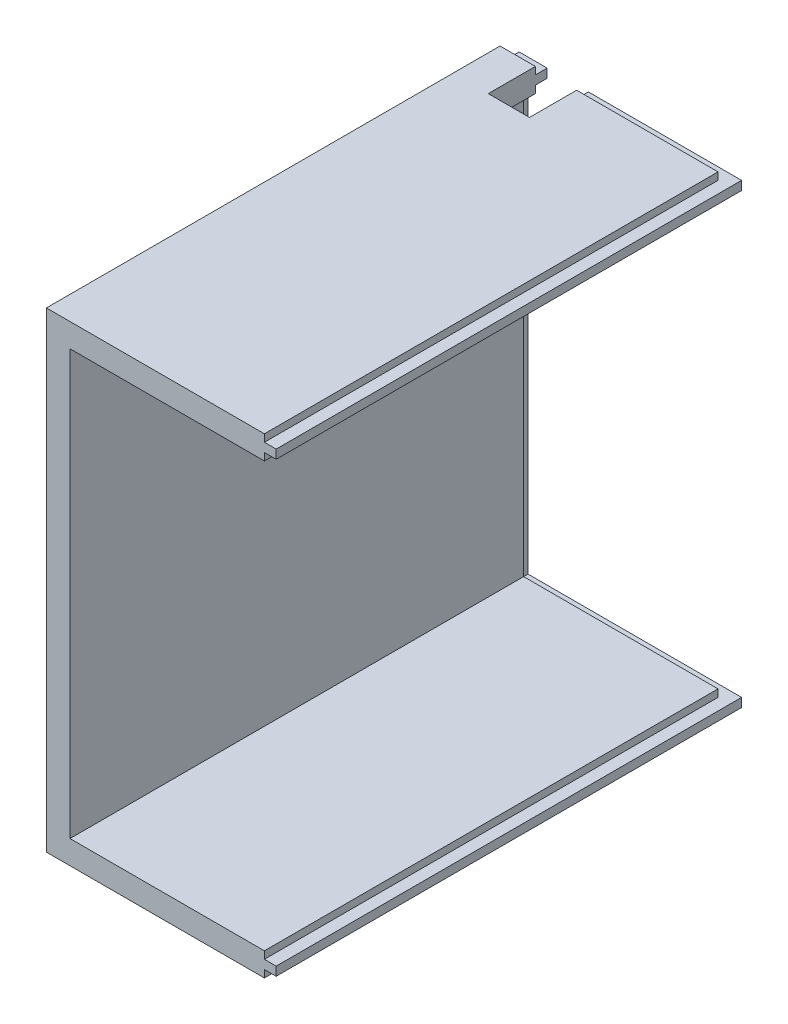
ISO-10303-21;
HEADER;
FILE_DESCRIPTION(('STEP AP214'),'2;1');
FILE_NAME('part.step','',(''),(''),'','','');
FILE_SCHEMA(('AUTOMOTIVE_DESIGN { 1 0 10303 214 1 1 1 1 }'));
ENDSEC;
DATA;
#1=APPLICATION_CONTEXT('core data for automotive mechanical design processes');
#2=APPLICATION_PROTOCOL_DEFINITION('international standard','automotive_design',2000,#1);
#3=PRODUCT_CONTEXT('',#1,'mechanical');
#4=PRODUCT('Part','Part','',(#3));
#5=PRODUCT_RELATED_PRODUCT_CATEGORY('part','',(#4));
#6=PRODUCT_DEFINITION_FORMATION('','',#4);
#7=PRODUCT_DEFINITION_CONTEXT('part definition',#1,'design');
#8=PRODUCT_DEFINITION('design','',#6,#7);
#9=PRODUCT_DEFINITION_SHAPE('','',#8);
#10=(LENGTH_UNIT() NAMED_UNIT(*) SI_UNIT(.MILLI.,.METRE.));
#11=(NAMED_UNIT(*) PLANE_ANGLE_UNIT() SI_UNIT($,.RADIAN.));
#12=(NAMED_UNIT(*) SI_UNIT($,.STERADIAN.) SOLID_ANGLE_UNIT());
#13=UNCERTAINTY_MEASURE_WITH_UNIT(LENGTH_MEASURE(1.E-05),#10,'distance_accuracy_value','');
#14=(GEOMETRIC_REPRESENTATION_CONTEXT(3) GLOBAL_UNCERTAINTY_ASSIGNED_CONTEXT((#13)) GLOBAL_UNIT_ASSIGNED_CONTEXT((#10,
#11,#12)) REPRESENTATION_CONTEXT('',''));
#15=CARTESIAN_POINT('',(0.,0.,0.));
#16=DIRECTION('',(0.,0.,1.));
#17=DIRECTION('',(1.,0.,0.));
#18=AXIS2_PLACEMENT_3D('',#15,#16,#17);
#19=CARTESIAN_POINT('',(0.,0.,-77.));
#20=DIRECTION('',(0.,0.,1.));
#21=DIRECTION('',(1.,0.,0.));
#22=AXIS2_PLACEMENT_3D('',#19,#20,#21);
#23=PLANE('',#22);
#24=DIRECTION('',(-1.,0.,0.));
#25=VECTOR('',#24,1.);
#26=CARTESIAN_POINT('',(0.,38.75,-77.));
#27=LINE('',#26,#25);
#28=CARTESIAN_POINT('',(17.5,38.75,-77.));
#29=VERTEX_POINT('',#28);
#30=CARTESIAN_POINT('',(-6.49999999999999,38.75,-77.));
#31=VERTEX_POINT('',#30);
#32=EDGE_CURVE('E309',#29,#31,#27,.T.);
#33=ORIENTED_EDGE('',*,*,#32,.T.);
#34=DIRECTION('',(0.,1.,0.));
#35=VECTOR('',#34,1.);
#36=CARTESIAN_POINT('',(-6.49999999999999,0.,-77.));
#37=LINE('',#36,#35);
#38=CARTESIAN_POINT('',(-6.49999999999999,40.,-77.));
#39=VERTEX_POINT('',#38);
#40=EDGE_CURVE('E271',#31,#39,#37,.T.);
#41=ORIENTED_EDGE('',*,*,#40,.T.);
#42=DIRECTION('',(1.,0.,0.));
#43=VECTOR('',#42,1.);
#44=CARTESIAN_POINT('',(0.,40.,-77.));
#45=LINE('',#44,#43);
#46=CARTESIAN_POINT('',(17.5,40.,-77.));
#47=VERTEX_POINT('',#46);
#48=EDGE_CURVE('E408',#39,#47,#45,.T.);
#49=ORIENTED_EDGE('',*,*,#48,.T.);
#50=DIRECTION('',(0.,1.,0.));
#51=VECTOR('',#50,1.);
#52=CARTESIAN_POINT('',(17.5,40.,-77.));
#53=LINE('',#52,#51);
#54=EDGE_CURVE('E357',#29,#47,#53,.T.);
#55=ORIENTED_EDGE('',*,*,#54,.F.);
#56=EDGE_LOOP('',(#33,#41,#49,#55));
#57=FACE_BOUND('',#56,.T.);
#58=ADVANCED_FACE('F41',(#57),#23,.F.);
#59=DIRECTION('',(1.,0.,0.));
#60=VECTOR('',#59,1.);
#61=CARTESIAN_POINT('',(0.,36.,-77.));
#62=LINE('',#61,#60);
#63=CARTESIAN_POINT('',(-6.49999999999999,36.,-77.));
#64=VERTEX_POINT('',#63);
#65=CARTESIAN_POINT('',(17.5,36.,-77.));
#66=VERTEX_POINT('',#65);
#67=EDGE_CURVE('E407',#64,#66,#62,.T.);
#68=ORIENTED_EDGE('',*,*,#67,.F.);
#69=DIRECTION('',(0.,1.,0.));
#70=VECTOR('',#69,1.);
#71=CARTESIAN_POINT('',(-6.49999999999999,0.,-77.));
#72=LINE('',#71,#70);
#73=CARTESIAN_POINT('',(-6.49999999999999,37.2500000000001,-77.));
#74=VERTEX_POINT('',#73);
#75=EDGE_CURVE('E280',#64,#74,#72,.T.);
#76=ORIENTED_EDGE('',*,*,#75,.T.);
#77=DIRECTION('',(-1.,0.,0.));
#78=VECTOR('',#77,1.);
#79=CARTESIAN_POINT('',(1.29236898960272E-13,37.2500000000001,-77.));
#80=LINE('',#79,#78);
#81=CARTESIAN_POINT('',(17.5,37.25,-77.));
#82=VERTEX_POINT('',#81);
#83=EDGE_CURVE('E314',#82,#74,#80,.T.);
#84=ORIENTED_EDGE('',*,*,#83,.F.);
#85=DIRECTION('',(0.,1.,0.));
#86=VECTOR('',#85,1.);
#87=CARTESIAN_POINT('',(17.5,37.25,-77.));
#88=LINE('',#87,#86);
#89=EDGE_CURVE('E345',#66,#82,#88,.T.);
#90=ORIENTED_EDGE('',*,*,#89,.F.);
#91=EDGE_LOOP('',(#68,#76,#84,#90));
#92=FACE_BOUND('',#91,.T.);
#93=ADVANCED_FACE('F530',(#92),#23,.F.);
#94=CARTESIAN_POINT('',(0.,40.,-77.));
#95=DIRECTION('',(0.,-1.,0.));
#96=DIRECTION('',(0.,0.,-1.));
#97=AXIS2_PLACEMENT_3D('',#94,#95,#96);
#98=PLANE('',#97);
#99=DIRECTION('',(0.,0.,-1.));
#100=VECTOR('',#99,1.);
#101=CARTESIAN_POINT('',(-6.49999999999999,40.,-79.));
#102=LINE('',#101,#100);
#103=CARTESIAN_POINT('',(-6.49999999999999,40.,-69.));
#104=VERTEX_POINT('',#103);
#105=EDGE_CURVE('E243',#104,#39,#102,.T.);
#106=ORIENTED_EDGE('',*,*,#105,.F.);
#107=DIRECTION('',(1.,0.,0.));
#108=VECTOR('',#107,1.);
#109=CARTESIAN_POINT('',(-13.5,40.,-69.));
#110=LINE('',#109,#108);
#111=CARTESIAN_POINT('',(-13.5,40.,-69.));
#112=VERTEX_POINT('',#111);
#113=EDGE_CURVE('E235',#112,#104,#110,.T.);
#114=ORIENTED_EDGE('',*,*,#113,.F.);
#115=DIRECTION('',(0.,0.,1.));
#116=VECTOR('',#115,1.);
#117=CARTESIAN_POINT('',(-13.5,40.,-79.));
#118=LINE('',#117,#116);
#119=CARTESIAN_POINT('',(-13.5,40.,-77.));
#120=VERTEX_POINT('',#119);
#121=EDGE_CURVE('E239',#120,#112,#118,.T.);
#122=ORIENTED_EDGE('',*,*,#121,.F.);
#123=CARTESIAN_POINT('',(-19.5,40.,-77.));
#124=VERTEX_POINT('',#123);
#125=EDGE_CURVE('E411',#124,#120,#45,.T.);
#126=ORIENTED_EDGE('',*,*,#125,.F.);
#127=DIRECTION('',(0.,0.,1.));
#128=VECTOR('',#127,1.);
#129=CARTESIAN_POINT('',(-19.5,40.,-77.));
#130=LINE('',#129,#128);
#131=CARTESIAN_POINT('',(-19.5,40.,0.));
#132=VERTEX_POINT('',#131);
#133=EDGE_CURVE('E442',#124,#132,#130,.T.);
#134=ORIENTED_EDGE('',*,*,#133,.T.);
#135=DIRECTION('',(1.,0.,0.));
#136=VECTOR('',#135,1.);
#137=CARTESIAN_POINT('',(0.,40.,0.));
#138=LINE('',#137,#136);
#139=CARTESIAN_POINT('',(17.5,40.,0.));
#140=VERTEX_POINT('',#139);
#141=EDGE_CURVE('E431',#132,#140,#138,.T.);
#142=ORIENTED_EDGE('',*,*,#141,.T.);
#143=DIRECTION('',(0.,0.,-1.));
#144=VECTOR('',#143,1.);
#145=CARTESIAN_POINT('',(17.5,40.,0.));
#146=LINE('',#145,#144);
#147=EDGE_CURVE('E369',#140,#47,#146,.T.);
#148=ORIENTED_EDGE('',*,*,#147,.T.);
#149=ORIENTED_EDGE('',*,*,#48,.F.);
#150=EDGE_LOOP('',(#106,#114,#122,#126,#134,#142,#148,#149));
#151=FACE_BOUND('',#150,.T.);
#152=ADVANCED_FACE('F250',(#151),#98,.F.);
#153=CARTESIAN_POINT('',(19.5,37.25,0.));
#154=DIRECTION('',(0.,1.,0.));
#155=DIRECTION('',(-1.,0.,0.));
#156=AXIS2_PLACEMENT_3D('',#153,#154,#155);
#157=PLANE('',#156);
#158=ORIENTED_EDGE('',*,*,#83,.T.);
#159=DIRECTION('',(0.,0.,-1.));
#160=VECTOR('',#159,1.);
#161=CARTESIAN_POINT('',(-6.49999999999997,37.2500000000001,0.));
#162=LINE('',#161,#160);
#163=CARTESIAN_POINT('',(-6.49999999999999,37.2500000000001,-79.));
#164=VERTEX_POINT('',#163);
#165=EDGE_CURVE('E273',#74,#164,#162,.T.);
#166=ORIENTED_EDGE('',*,*,#165,.T.);
#167=DIRECTION('',(-1.,0.,0.));
#168=VECTOR('',#167,1.);
#169=CARTESIAN_POINT('',(1.29236898960272E-13,37.2500000000001,-79.));
#170=LINE('',#169,#168);
#171=CARTESIAN_POINT('',(19.5,37.25,-79.));
#172=VERTEX_POINT('',#171);
#173=EDGE_CURVE('E293',#172,#164,#170,.T.);
#174=ORIENTED_EDGE('',*,*,#173,.F.);
#175=DIRECTION('',(0.,0.,-1.));
#176=VECTOR('',#175,1.);
#177=CARTESIAN_POINT('',(19.5,37.25,0.));
#178=LINE('',#177,#176);
#179=CARTESIAN_POINT('',(19.5,37.25,0.));
#180=VERTEX_POINT('',#179);
#181=EDGE_CURVE('E340',#180,#172,#178,.T.);
#182=ORIENTED_EDGE('',*,*,#181,.F.);
#183=DIRECTION('',(1.,0.,0.));
#184=VECTOR('',#183,1.);
#185=CARTESIAN_POINT('',(19.5,37.25,0.));
#186=LINE('',#185,#184);
#187=CARTESIAN_POINT('',(17.5,37.25,0.));
#188=VERTEX_POINT('',#187);
#189=EDGE_CURVE('E339',#188,#180,#186,.T.);
#190=ORIENTED_EDGE('',*,*,#189,.F.);
#191=DIRECTION('',(0.,0.,-1.));
#192=VECTOR('',#191,1.);
#193=CARTESIAN_POINT('',(17.5,37.25,0.));
#194=LINE('',#193,#192);
#195=EDGE_CURVE('E331',#188,#82,#194,.T.);
#196=ORIENTED_EDGE('',*,*,#195,.T.);
#197=EDGE_LOOP('',(#158,#166,#174,#182,#190,#196));
#198=FACE_BOUND('',#197,.T.);
#199=ADVANCED_FACE('F481',(#198),#157,.F.);
#200=CARTESIAN_POINT('',(19.5,38.75,0.));
#201=DIRECTION('',(0.,-1.,0.));
#202=DIRECTION('',(0.,0.,-1.));
#203=AXIS2_PLACEMENT_3D('',#200,#201,#202);
#204=PLANE('',#203);
#205=DIRECTION('',(-1.,0.,0.));
#206=VECTOR('',#205,1.);
#207=CARTESIAN_POINT('',(0.,38.75,-79.));
#208=LINE('',#207,#206);
#209=CARTESIAN_POINT('',(19.5,38.75,-79.));
#210=VERTEX_POINT('',#209);
#211=CARTESIAN_POINT('',(-6.49999999999999,38.75,-79.));
#212=VERTEX_POINT('',#211);
#213=EDGE_CURVE('E288',#210,#212,#208,.T.);
#214=ORIENTED_EDGE('',*,*,#213,.T.);
#215=DIRECTION('',(0.,0.,1.));
#216=VECTOR('',#215,1.);
#217=CARTESIAN_POINT('',(-6.49999999999997,38.75,0.));
#218=LINE('',#217,#216);
#219=EDGE_CURVE('E268',#212,#31,#218,.T.);
#220=ORIENTED_EDGE('',*,*,#219,.T.);
#221=ORIENTED_EDGE('',*,*,#32,.F.);
#222=DIRECTION('',(0.,0.,-1.));
#223=VECTOR('',#222,1.);
#224=CARTESIAN_POINT('',(17.5,38.75,0.));
#225=LINE('',#224,#223);
#226=CARTESIAN_POINT('',(17.5,38.75,0.));
#227=VERTEX_POINT('',#226);
#228=EDGE_CURVE('E344',#227,#29,#225,.T.);
#229=ORIENTED_EDGE('',*,*,#228,.F.);
#230=DIRECTION('',(-1.,0.,0.));
#231=VECTOR('',#230,1.);
#232=CARTESIAN_POINT('',(19.5,38.75,0.));
#233=LINE('',#232,#231);
#234=CARTESIAN_POINT('',(19.5,38.75,0.));
#235=VERTEX_POINT('',#234);
#236=EDGE_CURVE('E375',#235,#227,#233,.T.);
#237=ORIENTED_EDGE('',*,*,#236,.F.);
#238=DIRECTION('',(0.,0.,-1.));
#239=VECTOR('',#238,1.);
#240=CARTESIAN_POINT('',(19.5,38.75,0.));
#241=LINE('',#240,#239);
#242=EDGE_CURVE('E373',#235,#210,#241,.T.);
#243=ORIENTED_EDGE('',*,*,#242,.T.);
#244=EDGE_LOOP('',(#214,#220,#221,#229,#237,#243));
#245=FACE_BOUND('',#244,.T.);
#246=ADVANCED_FACE('F491',(#245),#204,.F.);
#247=CARTESIAN_POINT('',(0.,0.,-79.));
#248=DIRECTION('',(0.,0.,-1.));
#249=DIRECTION('',(-1.,0.,0.));
#250=AXIS2_PLACEMENT_3D('',#247,#248,#249);
#251=PLANE('',#250);
#252=ORIENTED_EDGE('',*,*,#173,.T.);
#253=DIRECTION('',(0.,1.,0.));
#254=VECTOR('',#253,1.);
#255=CARTESIAN_POINT('',(-6.49999999999999,35.,-79.));
#256=LINE('',#255,#254);
#257=EDGE_CURVE('E47',#164,#212,#256,.T.);
#258=ORIENTED_EDGE('',*,*,#257,.T.);
#259=ORIENTED_EDGE('',*,*,#213,.F.);
#260=DIRECTION('',(0.,-1.,0.));
#261=VECTOR('',#260,1.);
#262=CARTESIAN_POINT('',(19.5,0.,-79.));
#263=LINE('',#262,#261);
#264=EDGE_CURVE('E292',#210,#172,#263,.T.);
#265=ORIENTED_EDGE('',*,*,#264,.T.);
#266=EDGE_LOOP('',(#252,#258,#259,#265));
#267=FACE_BOUND('',#266,.T.);
#268=ADVANCED_FACE('F487',(#267),#251,.T.);
#269=ORIENTED_EDGE('',*,*,#125,.T.);
#270=DIRECTION('',(0.,-1.,0.));
#271=VECTOR('',#270,1.);
#272=CARTESIAN_POINT('',(-13.5,0.,-77.));
#273=LINE('',#272,#271);
#274=CARTESIAN_POINT('',(-13.5,38.75,-77.));
#275=VERTEX_POINT('',#274);
#276=EDGE_CURVE('E242',#120,#275,#273,.T.);
#277=ORIENTED_EDGE('',*,*,#276,.T.);
#278=CARTESIAN_POINT('',(-18.25,38.75,-77.));
#279=VERTEX_POINT('',#278);
#280=EDGE_CURVE('E61',#275,#279,#27,.T.);
#281=ORIENTED_EDGE('',*,*,#280,.T.);
#282=DIRECTION('',(0.,-1.,0.));
#283=VECTOR('',#282,1.);
#284=CARTESIAN_POINT('',(-18.25,0.,-77.));
#285=LINE('',#284,#283);
#286=CARTESIAN_POINT('',(-18.25,-38.75,-77.));
#287=VERTEX_POINT('',#286);
#288=EDGE_CURVE('E284',#279,#287,#285,.T.);
#289=ORIENTED_EDGE('',*,*,#288,.T.);
#290=DIRECTION('',(-1.,0.,0.));
#291=VECTOR('',#290,1.);
#292=CARTESIAN_POINT('',(0.,-38.75,-77.));
#293=LINE('',#292,#291);
#294=CARTESIAN_POINT('',(17.5,-38.75,-77.));
#295=VERTEX_POINT('',#294);
#296=EDGE_CURVE('E311',#295,#287,#293,.T.);
#297=ORIENTED_EDGE('',*,*,#296,.F.);
#298=DIRECTION('',(0.,1.,0.));
#299=VECTOR('',#298,1.);
#300=CARTESIAN_POINT('',(17.5,-38.75,-77.));
#301=LINE('',#300,#299);
#302=CARTESIAN_POINT('',(17.5,-40.,-77.));
#303=VERTEX_POINT('',#302);
#304=EDGE_CURVE('E359',#303,#295,#301,.T.);
#305=ORIENTED_EDGE('',*,*,#304,.F.);
#306=DIRECTION('',(1.,0.,0.));
#307=VECTOR('',#306,1.);
#308=CARTESIAN_POINT('',(0.,-40.,-77.));
#309=LINE('',#308,#307);
#310=CARTESIAN_POINT('',(-19.5,-40.,-77.));
#311=VERTEX_POINT('',#310);
#312=EDGE_CURVE('E418',#311,#303,#309,.T.);
#313=ORIENTED_EDGE('',*,*,#312,.F.);
#314=DIRECTION('',(0.,-1.,0.));
#315=VECTOR('',#314,1.);
#316=CARTESIAN_POINT('',(-19.5,0.,-77.));
#317=LINE('',#316,#315);
#318=EDGE_CURVE('E413',#124,#311,#317,.T.);
#319=ORIENTED_EDGE('',*,*,#318,.F.);
#320=EDGE_LOOP('',(#269,#277,#281,#289,#297,#305,#313,#319));
#321=FACE_BOUND('',#320,.T.);
#322=ADVANCED_FACE('F510',(#321),#23,.F.);
#323=CARTESIAN_POINT('',(19.5,0.,-77.));
#324=DIRECTION('',(-1.,0.,0.));
#325=DIRECTION('',(0.,0.,1.));
#326=AXIS2_PLACEMENT_3D('',#323,#324,#325);
#327=PLANE('',#326);
#328=DIRECTION('',(0.,-1.,0.));
#329=VECTOR('',#328,1.);
#330=CARTESIAN_POINT('',(19.5,0.,0.));
#331=LINE('',#330,#329);
#332=CARTESIAN_POINT('',(19.5,-37.25,0.));
#333=VERTEX_POINT('',#332);
#334=CARTESIAN_POINT('',(19.5,-38.75,0.));
#335=VERTEX_POINT('',#334);
#336=EDGE_CURVE('E404',#333,#335,#331,.T.);
#337=ORIENTED_EDGE('',*,*,#336,.T.);
#338=DIRECTION('',(0.,0.,-1.));
#339=VECTOR('',#338,1.);
#340=CARTESIAN_POINT('',(19.5,-38.75,0.));
#341=LINE('',#340,#339);
#342=CARTESIAN_POINT('',(19.5,-38.75,-79.));
#343=VERTEX_POINT('',#342);
#344=EDGE_CURVE('E353',#335,#343,#341,.T.);
#345=ORIENTED_EDGE('',*,*,#344,.T.);
#346=DIRECTION('',(0.,-1.,0.));
#347=VECTOR('',#346,1.);
#348=CARTESIAN_POINT('',(19.5,0.,-79.));
#349=LINE('',#348,#347);
#350=CARTESIAN_POINT('',(19.5,-37.25,-79.));
#351=VERTEX_POINT('',#350);
#352=EDGE_CURVE('E303',#351,#343,#349,.T.);
#353=ORIENTED_EDGE('',*,*,#352,.F.);
#354=DIRECTION('',(0.,0.,-1.));
#355=VECTOR('',#354,1.);
#356=CARTESIAN_POINT('',(19.5,-37.25,0.));
#357=LINE('',#356,#355);
#358=EDGE_CURVE('E396',#333,#351,#357,.T.);
#359=ORIENTED_EDGE('',*,*,#358,.F.);
#360=EDGE_LOOP('',(#337,#345,#353,#359));
#361=FACE_BOUND('',#360,.T.);
#362=ADVANCED_FACE('F514',(#361),#327,.F.);
#363=ORIENTED_EDGE('',*,*,#242,.F.);
#364=EDGE_CURVE('E430',#235,#180,#331,.T.);
#365=ORIENTED_EDGE('',*,*,#364,.T.);
#366=ORIENTED_EDGE('',*,*,#181,.T.);
#367=ORIENTED_EDGE('',*,*,#264,.F.);
#368=EDGE_LOOP('',(#363,#365,#366,#367));
#369=FACE_BOUND('',#368,.T.);
#370=ADVANCED_FACE('F486',(#369),#327,.F.);
#371=CARTESIAN_POINT('',(-13.5,37.2500000000001,-77.));
#372=VERTEX_POINT('',#371);
#373=CARTESIAN_POINT('',(-16.75,37.2500000000001,-77.));
#374=VERTEX_POINT('',#373);
#375=EDGE_CURVE('E320',#372,#374,#80,.T.);
#376=ORIENTED_EDGE('',*,*,#375,.F.);
#377=DIRECTION('',(0.,-1.,0.));
#378=VECTOR('',#377,1.);
#379=CARTESIAN_POINT('',(-13.5,0.,-77.));
#380=LINE('',#379,#378);
#381=CARTESIAN_POINT('',(-13.5,36.,-77.));
#382=VERTEX_POINT('',#381);
#383=EDGE_CURVE('E263',#372,#382,#380,.T.);
#384=ORIENTED_EDGE('',*,*,#383,.T.);
#385=CARTESIAN_POINT('',(-15.5,36.,-77.));
#386=VERTEX_POINT('',#385);
#387=EDGE_CURVE('E409',#386,#382,#62,.T.);
#388=ORIENTED_EDGE('',*,*,#387,.F.);
#389=DIRECTION('',(0.,-1.,0.));
#390=VECTOR('',#389,1.);
#391=CARTESIAN_POINT('',(-15.5,0.,-77.));
#392=LINE('',#391,#390);
#393=CARTESIAN_POINT('',(-15.5,-36.,-77.));
#394=VERTEX_POINT('',#393);
#395=EDGE_CURVE('E401',#386,#394,#392,.T.);
#396=ORIENTED_EDGE('',*,*,#395,.T.);
#397=DIRECTION('',(1.,0.,0.));
#398=VECTOR('',#397,1.);
#399=CARTESIAN_POINT('',(0.,-36.,-77.));
#400=LINE('',#399,#398);
#401=CARTESIAN_POINT('',(17.5,-36.,-77.));
#402=VERTEX_POINT('',#401);
#403=EDGE_CURVE('E399',#394,#402,#400,.T.);
#404=ORIENTED_EDGE('',*,*,#403,.T.);
#405=DIRECTION('',(0.,1.,0.));
#406=VECTOR('',#405,1.);
#407=CARTESIAN_POINT('',(17.5,-36.,-77.));
#408=LINE('',#407,#406);
#409=CARTESIAN_POINT('',(17.5,-37.25,-77.));
#410=VERTEX_POINT('',#409);
#411=EDGE_CURVE('E361',#410,#402,#408,.T.);
#412=ORIENTED_EDGE('',*,*,#411,.F.);
#413=DIRECTION('',(-1.,0.,0.));
#414=VECTOR('',#413,1.);
#415=CARTESIAN_POINT('',(0.,-37.25,-77.));
#416=LINE('',#415,#414);
#417=CARTESIAN_POINT('',(-16.75,-37.25,-77.));
#418=VERTEX_POINT('',#417);
#419=EDGE_CURVE('E254',#410,#418,#416,.T.);
#420=ORIENTED_EDGE('',*,*,#419,.T.);
#421=DIRECTION('',(0.,-1.,0.));
#422=VECTOR('',#421,1.);
#423=CARTESIAN_POINT('',(-16.75,0.,-77.));
#424=LINE('',#423,#422);
#425=EDGE_CURVE('E290',#374,#418,#424,.T.);
#426=ORIENTED_EDGE('',*,*,#425,.F.);
#427=EDGE_LOOP('',(#376,#384,#388,#396,#404,#412,#420,#426));
#428=FACE_BOUND('',#427,.T.);
#429=ADVANCED_FACE('F470',(#428),#23,.F.);
#430=CARTESIAN_POINT('',(0.,0.,0.));
#431=DIRECTION('',(0.,0.,1.));
#432=DIRECTION('',(1.,0.,0.));
#433=AXIS2_PLACEMENT_3D('',#430,#431,#432);
#434=PLANE('',#433);
#435=DIRECTION('',(1.,0.,0.));
#436=VECTOR('',#435,1.);
#437=CARTESIAN_POINT('',(0.,-40.,0.));
#438=LINE('',#437,#436);
#439=CARTESIAN_POINT('',(-19.5,-40.,0.));
#440=VERTEX_POINT('',#439);
#441=CARTESIAN_POINT('',(17.5,-40.,0.));
#442=VERTEX_POINT('',#441);
#443=EDGE_CURVE('E429',#440,#442,#438,.T.);
#444=ORIENTED_EDGE('',*,*,#443,.T.);
#445=DIRECTION('',(0.,1.,0.));
#446=VECTOR('',#445,1.);
#447=CARTESIAN_POINT('',(17.5,-38.75,0.));
#448=LINE('',#447,#446);
#449=CARTESIAN_POINT('',(17.5,-38.75,0.));
#450=VERTEX_POINT('',#449);
#451=EDGE_CURVE('E365',#442,#450,#448,.T.);
#452=ORIENTED_EDGE('',*,*,#451,.T.);
#453=DIRECTION('',(1.,0.,0.));
#454=VECTOR('',#453,1.);
#455=CARTESIAN_POINT('',(19.5,-38.75,0.));
#456=LINE('',#455,#454);
#457=EDGE_CURVE('E351',#450,#335,#456,.T.);
#458=ORIENTED_EDGE('',*,*,#457,.T.);
#459=ORIENTED_EDGE('',*,*,#336,.F.);
#460=DIRECTION('',(-1.,0.,0.));
#461=VECTOR('',#460,1.);
#462=CARTESIAN_POINT('',(19.5,-37.25,0.));
#463=LINE('',#462,#461);
#464=CARTESIAN_POINT('',(17.5,-37.25,0.));
#465=VERTEX_POINT('',#464);
#466=EDGE_CURVE('E390',#333,#465,#463,.T.);
#467=ORIENTED_EDGE('',*,*,#466,.T.);
#468=DIRECTION('',(0.,1.,0.));
#469=VECTOR('',#468,1.);
#470=CARTESIAN_POINT('',(17.5,-36.,0.));
#471=LINE('',#470,#469);
#472=CARTESIAN_POINT('',(17.5,-36.,0.));
#473=VERTEX_POINT('',#472);
#474=EDGE_CURVE('E383',#465,#473,#471,.T.);
#475=ORIENTED_EDGE('',*,*,#474,.T.);
#476=DIRECTION('',(1.,0.,0.));
#477=VECTOR('',#476,1.);
#478=CARTESIAN_POINT('',(0.,-36.,0.));
#479=LINE('',#478,#477);
#480=CARTESIAN_POINT('',(-15.5,-36.,0.));
#481=VERTEX_POINT('',#480);
#482=EDGE_CURVE('E393',#481,#473,#479,.T.);
#483=ORIENTED_EDGE('',*,*,#482,.F.);
#484=DIRECTION('',(0.,-1.,0.));
#485=VECTOR('',#484,1.);
#486=CARTESIAN_POINT('',(-15.5,0.,0.));
#487=LINE('',#486,#485);
#488=CARTESIAN_POINT('',(-15.5,36.,0.));
#489=VERTEX_POINT('',#488);
#490=EDGE_CURVE('E425',#489,#481,#487,.T.);
#491=ORIENTED_EDGE('',*,*,#490,.F.);
#492=DIRECTION('',(1.,0.,0.));
#493=VECTOR('',#492,1.);
#494=CARTESIAN_POINT('',(0.,36.,0.));
#495=LINE('',#494,#493);
#496=CARTESIAN_POINT('',(17.5,36.,0.));
#497=VERTEX_POINT('',#496);
#498=EDGE_CURVE('E424',#489,#497,#495,.T.);
#499=ORIENTED_EDGE('',*,*,#498,.T.);
#500=DIRECTION('',(0.,1.,0.));
#501=VECTOR('',#500,1.);
#502=CARTESIAN_POINT('',(17.5,37.25,0.));
#503=LINE('',#502,#501);
#504=EDGE_CURVE('E347',#497,#188,#503,.T.);
#505=ORIENTED_EDGE('',*,*,#504,.T.);
#506=ORIENTED_EDGE('',*,*,#189,.T.);
#507=ORIENTED_EDGE('',*,*,#364,.F.);
#508=ORIENTED_EDGE('',*,*,#236,.T.);
#509=DIRECTION('',(0.,1.,0.));
#510=VECTOR('',#509,1.);
#511=CARTESIAN_POINT('',(17.5,40.,0.));
#512=LINE('',#511,#510);
#513=EDGE_CURVE('E377',#227,#140,#512,.T.);
#514=ORIENTED_EDGE('',*,*,#513,.T.);
#515=ORIENTED_EDGE('',*,*,#141,.F.);
#516=DIRECTION('',(0.,-1.,0.));
#517=VECTOR('',#516,1.);
#518=CARTESIAN_POINT('',(-19.5,0.,0.));
#519=LINE('',#518,#517);
#520=EDGE_CURVE('E432',#132,#440,#519,.T.);
#521=ORIENTED_EDGE('',*,*,#520,.T.);
#522=EDGE_LOOP('',(#444,#452,#458,#459,#467,#475,#483,#491,#499,#505,#506,#507,#508,#514,#515,#521));
#523=FACE_BOUND('',#522,.T.);
#524=ADVANCED_FACE('F453',(#523),#434,.T.);
#525=CARTESIAN_POINT('',(0.,-36.,-77.));
#526=DIRECTION('',(0.,-1.,0.));
#527=DIRECTION('',(1.,0.,0.));
#528=AXIS2_PLACEMENT_3D('',#525,#526,#527);
#529=PLANE('',#528);
#530=ORIENTED_EDGE('',*,*,#482,.T.);
#531=DIRECTION('',(0.,0.,-1.));
#532=VECTOR('',#531,1.);
#533=CARTESIAN_POINT('',(17.5,-36.,0.));
#534=LINE('',#533,#532);
#535=EDGE_CURVE('E388',#473,#402,#534,.T.);
#536=ORIENTED_EDGE('',*,*,#535,.T.);
#537=ORIENTED_EDGE('',*,*,#403,.F.);
#538=DIRECTION('',(0.,0.,1.));
#539=VECTOR('',#538,1.);
#540=CARTESIAN_POINT('',(-15.5,-36.,-77.));
#541=LINE('',#540,#539);
#542=EDGE_CURVE('E420',#394,#481,#541,.T.);
#543=ORIENTED_EDGE('',*,*,#542,.T.);
#544=EDGE_LOOP('',(#530,#536,#537,#543));
#545=FACE_BOUND('',#544,.T.);
#546=ADVANCED_FACE('F43',(#545),#529,.F.);
#547=CARTESIAN_POINT('',(0.,-40.,-77.));
#548=DIRECTION('',(0.,-1.,0.));
#549=DIRECTION('',(0.,0.,-1.));
#550=AXIS2_PLACEMENT_3D('',#547,#548,#549);
#551=PLANE('',#550);
#552=DIRECTION('',(0.,0.,-1.));
#553=VECTOR('',#552,1.);
#554=CARTESIAN_POINT('',(17.5,-40.,0.));
#555=LINE('',#554,#553);
#556=EDGE_CURVE('E360',#442,#303,#555,.T.);
#557=ORIENTED_EDGE('',*,*,#556,.F.);
#558=ORIENTED_EDGE('',*,*,#443,.F.);
#559=DIRECTION('',(0.,0.,1.));
#560=VECTOR('',#559,1.);
#561=CARTESIAN_POINT('',(-19.5,-40.,-77.));
#562=LINE('',#561,#560);
#563=EDGE_CURVE('E438',#311,#440,#562,.T.);
#564=ORIENTED_EDGE('',*,*,#563,.F.);
#565=ORIENTED_EDGE('',*,*,#312,.T.);
#566=EDGE_LOOP('',(#557,#558,#564,#565));
#567=FACE_BOUND('',#566,.T.);
#568=ADVANCED_FACE('F504',(#567),#551,.T.);
#569=CARTESIAN_POINT('',(-19.5,0.,-77.));
#570=DIRECTION('',(-1.,0.,0.));
#571=DIRECTION('',(0.,-1.,0.));
#572=AXIS2_PLACEMENT_3D('',#569,#570,#571);
#573=PLANE('',#572);
#574=ORIENTED_EDGE('',*,*,#520,.F.);
#575=ORIENTED_EDGE('',*,*,#133,.F.);
#576=ORIENTED_EDGE('',*,*,#318,.T.);
#577=ORIENTED_EDGE('',*,*,#563,.T.);
#578=EDGE_LOOP('',(#574,#575,#576,#577));
#579=FACE_BOUND('',#578,.T.);
#580=ADVANCED_FACE('F499',(#579),#573,.T.);
#581=CARTESIAN_POINT('',(0.,36.,-77.));
#582=DIRECTION('',(0.,-1.,0.));
#583=DIRECTION('',(1.,0.,0.));
#584=AXIS2_PLACEMENT_3D('',#581,#582,#583);
#585=PLANE('',#584);
#586=DIRECTION('',(0.,0.,1.));
#587=VECTOR('',#586,1.);
#588=CARTESIAN_POINT('',(-6.49999999999999,36.,-77.));
#589=LINE('',#588,#587);
#590=CARTESIAN_POINT('',(-6.49999999999999,36.,-69.));
#591=VERTEX_POINT('',#590);
#592=EDGE_CURVE('E278',#64,#591,#589,.T.);
#593=ORIENTED_EDGE('',*,*,#592,.F.);
#594=ORIENTED_EDGE('',*,*,#67,.T.);
#595=DIRECTION('',(0.,0.,-1.));
#596=VECTOR('',#595,1.);
#597=CARTESIAN_POINT('',(17.5,36.,0.));
#598=LINE('',#597,#596);
#599=EDGE_CURVE('E334',#497,#66,#598,.T.);
#600=ORIENTED_EDGE('',*,*,#599,.F.);
#601=ORIENTED_EDGE('',*,*,#498,.F.);
#602=DIRECTION('',(0.,0.,1.));
#603=VECTOR('',#602,1.);
#604=CARTESIAN_POINT('',(-15.5,36.,-77.));
#605=LINE('',#604,#603);
#606=EDGE_CURVE('E444',#386,#489,#605,.T.);
#607=ORIENTED_EDGE('',*,*,#606,.F.);
#608=ORIENTED_EDGE('',*,*,#387,.T.);
#609=DIRECTION('',(0.,0.,-1.));
#610=VECTOR('',#609,1.);
#611=CARTESIAN_POINT('',(-13.5,36.,-77.));
#612=LINE('',#611,#610);
#613=CARTESIAN_POINT('',(-13.5,36.,-69.));
#614=VERTEX_POINT('',#613);
#615=EDGE_CURVE('E266',#614,#382,#612,.T.);
#616=ORIENTED_EDGE('',*,*,#615,.F.);
#617=DIRECTION('',(-1.,0.,0.));
#618=VECTOR('',#617,1.);
#619=CARTESIAN_POINT('',(0.,36.,-69.));
#620=LINE('',#619,#618);
#621=EDGE_CURVE('E11',#591,#614,#620,.T.);
#622=ORIENTED_EDGE('',*,*,#621,.F.);
#623=EDGE_LOOP('',(#593,#594,#600,#601,#607,#608,#616,#622));
#624=FACE_BOUND('',#623,.T.);
#625=ADVANCED_FACE('F472',(#624),#585,.T.);
#626=CARTESIAN_POINT('',(-15.5,0.,-77.));
#627=DIRECTION('',(-1.,0.,0.));
#628=DIRECTION('',(0.,-1.,0.));
#629=AXIS2_PLACEMENT_3D('',#626,#627,#628);
#630=PLANE('',#629);
#631=ORIENTED_EDGE('',*,*,#490,.T.);
#632=ORIENTED_EDGE('',*,*,#542,.F.);
#633=ORIENTED_EDGE('',*,*,#395,.F.);
#634=ORIENTED_EDGE('',*,*,#606,.T.);
#635=EDGE_LOOP('',(#631,#632,#633,#634));
#636=FACE_BOUND('',#635,.T.);
#637=ADVANCED_FACE('F467',(#636),#630,.F.);
#638=CARTESIAN_POINT('',(17.5,-36.,0.));
#639=DIRECTION('',(-1.,0.,0.));
#640=DIRECTION('',(0.,0.,1.));
#641=AXIS2_PLACEMENT_3D('',#638,#639,#640);
#642=PLANE('',#641);
#643=ORIENTED_EDGE('',*,*,#411,.T.);
#644=ORIENTED_EDGE('',*,*,#535,.F.);
#645=ORIENTED_EDGE('',*,*,#474,.F.);
#646=DIRECTION('',(0.,0.,-1.));
#647=VECTOR('',#646,1.);
#648=CARTESIAN_POINT('',(17.5,-37.25,0.));
#649=LINE('',#648,#647);
#650=EDGE_CURVE('E394',#465,#410,#649,.T.);
#651=ORIENTED_EDGE('',*,*,#650,.T.);
#652=EDGE_LOOP('',(#643,#644,#645,#651));
#653=FACE_BOUND('',#652,.T.);
#654=ADVANCED_FACE('F456',(#653),#642,.F.);
#655=CARTESIAN_POINT('',(19.5,-37.25,0.));
#656=DIRECTION('',(0.,-1.,0.));
#657=DIRECTION('',(0.,0.,-1.));
#658=AXIS2_PLACEMENT_3D('',#655,#656,#657);
#659=PLANE('',#658);
#660=ORIENTED_EDGE('',*,*,#358,.T.);
#661=DIRECTION('',(-1.,0.,0.));
#662=VECTOR('',#661,1.);
#663=CARTESIAN_POINT('',(0.,-37.25,-79.));
#664=LINE('',#663,#662);
#665=CARTESIAN_POINT('',(-16.75,-37.25,-79.));
#666=VERTEX_POINT('',#665);
#667=EDGE_CURVE('E298',#351,#666,#664,.T.);
#668=ORIENTED_EDGE('',*,*,#667,.T.);
#669=DIRECTION('',(0.,0.,1.));
#670=VECTOR('',#669,1.);
#671=CARTESIAN_POINT('',(-16.75,-37.25,-79.));
#672=LINE('',#671,#670);
#673=EDGE_CURVE('E324',#666,#418,#672,.T.);
#674=ORIENTED_EDGE('',*,*,#673,.T.);
#675=ORIENTED_EDGE('',*,*,#419,.F.);
#676=ORIENTED_EDGE('',*,*,#650,.F.);
#677=ORIENTED_EDGE('',*,*,#466,.F.);
#678=EDGE_LOOP('',(#660,#668,#674,#675,#676,#677));
#679=FACE_BOUND('',#678,.T.);
#680=ADVANCED_FACE('F462',(#679),#659,.F.);
#681=CARTESIAN_POINT('',(17.5,37.25,0.));
#682=DIRECTION('',(-1.,0.,0.));
#683=DIRECTION('',(0.,-1.,0.));
#684=AXIS2_PLACEMENT_3D('',#681,#682,#683);
#685=PLANE('',#684);
#686=ORIENTED_EDGE('',*,*,#89,.T.);
#687=ORIENTED_EDGE('',*,*,#195,.F.);
#688=ORIENTED_EDGE('',*,*,#504,.F.);
#689=ORIENTED_EDGE('',*,*,#599,.T.);
#690=EDGE_LOOP('',(#686,#687,#688,#689));
#691=FACE_BOUND('',#690,.T.);
#692=ADVANCED_FACE('F476',(#691),#685,.F.);
#693=CARTESIAN_POINT('',(-13.5,37.2500000000001,-79.));
#694=VERTEX_POINT('',#693);
#695=CARTESIAN_POINT('',(-16.75,37.2500000000001,-79.));
#696=VERTEX_POINT('',#695);
#697=EDGE_CURVE('E294',#694,#696,#170,.T.);
#698=ORIENTED_EDGE('',*,*,#697,.F.);
#699=DIRECTION('',(0.,0.,1.));
#700=VECTOR('',#699,1.);
#701=CARTESIAN_POINT('',(-13.5,37.2500000000001,0.));
#702=LINE('',#701,#700);
#703=EDGE_CURVE('E257',#694,#372,#702,.T.);
#704=ORIENTED_EDGE('',*,*,#703,.T.);
#705=ORIENTED_EDGE('',*,*,#375,.T.);
#706=DIRECTION('',(0.,0.,1.));
#707=VECTOR('',#706,1.);
#708=CARTESIAN_POINT('',(-16.75,37.2500000000001,-79.));
#709=LINE('',#708,#707);
#710=EDGE_CURVE('E330',#696,#374,#709,.T.);
#711=ORIENTED_EDGE('',*,*,#710,.F.);
#712=EDGE_LOOP('',(#698,#704,#705,#711));
#713=FACE_BOUND('',#712,.T.);
#714=ADVANCED_FACE('F524',(#713),#157,.F.);
#715=CARTESIAN_POINT('',(17.5,40.,0.));
#716=DIRECTION('',(-1.,0.,0.));
#717=DIRECTION('',(0.,0.,1.));
#718=AXIS2_PLACEMENT_3D('',#715,#716,#717);
#719=PLANE('',#718);
#720=ORIENTED_EDGE('',*,*,#54,.T.);
#721=ORIENTED_EDGE('',*,*,#147,.F.);
#722=ORIENTED_EDGE('',*,*,#513,.F.);
#723=ORIENTED_EDGE('',*,*,#228,.T.);
#724=EDGE_LOOP('',(#720,#721,#722,#723));
#725=FACE_BOUND('',#724,.T.);
#726=ADVANCED_FACE('F531',(#725),#719,.F.);
#727=ORIENTED_EDGE('',*,*,#280,.F.);
#728=DIRECTION('',(0.,0.,-1.));
#729=VECTOR('',#728,1.);
#730=CARTESIAN_POINT('',(-13.5,38.75,0.));
#731=LINE('',#730,#729);
#732=CARTESIAN_POINT('',(-13.5,38.75,-79.));
#733=VERTEX_POINT('',#732);
#734=EDGE_CURVE('E252',#275,#733,#731,.T.);
#735=ORIENTED_EDGE('',*,*,#734,.T.);
#736=CARTESIAN_POINT('',(-18.25,38.75,-79.));
#737=VERTEX_POINT('',#736);
#738=EDGE_CURVE('E286',#733,#737,#208,.T.);
#739=ORIENTED_EDGE('',*,*,#738,.T.);
#740=DIRECTION('',(0.,0.,1.));
#741=VECTOR('',#740,1.);
#742=CARTESIAN_POINT('',(-18.25,38.75,-79.));
#743=LINE('',#742,#741);
#744=EDGE_CURVE('E329',#737,#279,#743,.T.);
#745=ORIENTED_EDGE('',*,*,#744,.T.);
#746=EDGE_LOOP('',(#727,#735,#739,#745));
#747=FACE_BOUND('',#746,.T.);
#748=ADVANCED_FACE('F532',(#747),#204,.F.);
#749=CARTESIAN_POINT('',(17.5,-38.75,0.));
#750=DIRECTION('',(-1.,0.,0.));
#751=DIRECTION('',(0.,0.,1.));
#752=AXIS2_PLACEMENT_3D('',#749,#750,#751);
#753=PLANE('',#752);
#754=ORIENTED_EDGE('',*,*,#304,.T.);
#755=DIRECTION('',(0.,0.,-1.));
#756=VECTOR('',#755,1.);
#757=CARTESIAN_POINT('',(17.5,-38.75,0.));
#758=LINE('',#757,#756);
#759=EDGE_CURVE('E352',#450,#295,#758,.T.);
#760=ORIENTED_EDGE('',*,*,#759,.F.);
#761=ORIENTED_EDGE('',*,*,#451,.F.);
#762=ORIENTED_EDGE('',*,*,#556,.T.);
#763=EDGE_LOOP('',(#754,#760,#761,#762));
#764=FACE_BOUND('',#763,.T.);
#765=ADVANCED_FACE('F506',(#764),#753,.F.);
#766=CARTESIAN_POINT('',(19.5,-38.75,0.));
#767=DIRECTION('',(0.,1.,0.));
#768=DIRECTION('',(0.,0.,1.));
#769=AXIS2_PLACEMENT_3D('',#766,#767,#768);
#770=PLANE('',#769);
#771=ORIENTED_EDGE('',*,*,#759,.T.);
#772=ORIENTED_EDGE('',*,*,#296,.T.);
#773=DIRECTION('',(0.,0.,1.));
#774=VECTOR('',#773,1.);
#775=CARTESIAN_POINT('',(-18.25,-38.75,-79.));
#776=LINE('',#775,#774);
#777=CARTESIAN_POINT('',(-18.25,-38.75,-79.));
#778=VERTEX_POINT('',#777);
#779=EDGE_CURVE('E306',#778,#287,#776,.T.);
#780=ORIENTED_EDGE('',*,*,#779,.F.);
#781=DIRECTION('',(-1.,0.,0.));
#782=VECTOR('',#781,1.);
#783=CARTESIAN_POINT('',(0.,-38.75,-79.));
#784=LINE('',#783,#782);
#785=EDGE_CURVE('E308',#343,#778,#784,.T.);
#786=ORIENTED_EDGE('',*,*,#785,.F.);
#787=ORIENTED_EDGE('',*,*,#344,.F.);
#788=ORIENTED_EDGE('',*,*,#457,.F.);
#789=EDGE_LOOP('',(#771,#772,#780,#786,#787,#788));
#790=FACE_BOUND('',#789,.T.);
#791=ADVANCED_FACE('F512',(#790),#770,.F.);
#792=CARTESIAN_POINT('',(-18.25,0.,-79.));
#793=DIRECTION('',(-1.,0.,0.));
#794=DIRECTION('',(0.,0.,1.));
#795=AXIS2_PLACEMENT_3D('',#792,#793,#794);
#796=PLANE('',#795);
#797=ORIENTED_EDGE('',*,*,#288,.F.);
#798=ORIENTED_EDGE('',*,*,#744,.F.);
#799=DIRECTION('',(0.,-1.,0.));
#800=VECTOR('',#799,1.);
#801=CARTESIAN_POINT('',(-18.25,0.,-79.));
#802=LINE('',#801,#800);
#803=EDGE_CURVE('E285',#737,#778,#802,.T.);
#804=ORIENTED_EDGE('',*,*,#803,.T.);
#805=ORIENTED_EDGE('',*,*,#779,.T.);
#806=EDGE_LOOP('',(#797,#798,#804,#805));
#807=FACE_BOUND('',#806,.T.);
#808=ADVANCED_FACE('F580',(#807),#796,.T.);
#809=CARTESIAN_POINT('',(-16.75,0.,-79.));
#810=DIRECTION('',(-1.,0.,0.));
#811=DIRECTION('',(0.,-1.,0.));
#812=AXIS2_PLACEMENT_3D('',#809,#810,#811);
#813=PLANE('',#812);
#814=ORIENTED_EDGE('',*,*,#425,.T.);
#815=ORIENTED_EDGE('',*,*,#673,.F.);
#816=DIRECTION('',(0.,-1.,0.));
#817=VECTOR('',#816,1.);
#818=CARTESIAN_POINT('',(-16.75,0.,-79.));
#819=LINE('',#818,#817);
#820=EDGE_CURVE('E300',#696,#666,#819,.T.);
#821=ORIENTED_EDGE('',*,*,#820,.F.);
#822=ORIENTED_EDGE('',*,*,#710,.T.);
#823=EDGE_LOOP('',(#814,#815,#821,#822));
#824=FACE_BOUND('',#823,.T.);
#825=ADVANCED_FACE('F523',(#824),#813,.F.);
#826=DIRECTION('',(0.,1.,0.));
#827=VECTOR('',#826,1.);
#828=CARTESIAN_POINT('',(-13.5,35.,-79.));
#829=LINE('',#828,#827);
#830=EDGE_CURVE('E57',#694,#733,#829,.T.);
#831=ORIENTED_EDGE('',*,*,#830,.F.);
#832=ORIENTED_EDGE('',*,*,#697,.T.);
#833=ORIENTED_EDGE('',*,*,#820,.T.);
#834=ORIENTED_EDGE('',*,*,#667,.F.);
#835=ORIENTED_EDGE('',*,*,#352,.T.);
#836=ORIENTED_EDGE('',*,*,#785,.T.);
#837=ORIENTED_EDGE('',*,*,#803,.F.);
#838=ORIENTED_EDGE('',*,*,#738,.F.);
#839=EDGE_LOOP('',(#831,#832,#833,#834,#835,#836,#837,#838));
#840=FACE_BOUND('',#839,.T.);
#841=ADVANCED_FACE('F520',(#840),#251,.T.);
#842=CARTESIAN_POINT('',(-6.49999999999999,35.,-79.));
#843=DIRECTION('',(1.,0.,0.));
#844=DIRECTION('',(0.,0.,-1.));
#845=AXIS2_PLACEMENT_3D('',#842,#843,#844);
#846=PLANE('',#845);
#847=ORIENTED_EDGE('',*,*,#592,.T.);
#848=DIRECTION('',(0.,1.,0.));
#849=VECTOR('',#848,1.);
#850=CARTESIAN_POINT('',(-6.49999999999999,35.,-69.));
#851=LINE('',#850,#849);
#852=EDGE_CURVE('E237',#591,#104,#851,.T.);
#853=ORIENTED_EDGE('',*,*,#852,.T.);
#854=ORIENTED_EDGE('',*,*,#105,.T.);
#855=ORIENTED_EDGE('',*,*,#40,.F.);
#856=ORIENTED_EDGE('',*,*,#219,.F.);
#857=ORIENTED_EDGE('',*,*,#257,.F.);
#858=ORIENTED_EDGE('',*,*,#165,.F.);
#859=ORIENTED_EDGE('',*,*,#75,.F.);
#860=EDGE_LOOP('',(#847,#853,#854,#855,#856,#857,#858,#859));
#861=FACE_BOUND('',#860,.T.);
#862=ADVANCED_FACE('F529',(#861),#846,.F.);
#863=CARTESIAN_POINT('',(-13.5,35.,-79.));
#864=DIRECTION('',(-1.,0.,0.));
#865=DIRECTION('',(0.,0.,1.));
#866=AXIS2_PLACEMENT_3D('',#863,#864,#865);
#867=PLANE('',#866);
#868=ORIENTED_EDGE('',*,*,#615,.T.);
#869=ORIENTED_EDGE('',*,*,#383,.F.);
#870=ORIENTED_EDGE('',*,*,#703,.F.);
#871=ORIENTED_EDGE('',*,*,#830,.T.);
#872=ORIENTED_EDGE('',*,*,#734,.F.);
#873=ORIENTED_EDGE('',*,*,#276,.F.);
#874=ORIENTED_EDGE('',*,*,#121,.T.);
#875=DIRECTION('',(0.,1.,0.));
#876=VECTOR('',#875,1.);
#877=CARTESIAN_POINT('',(-13.5,35.,-69.));
#878=LINE('',#877,#876);
#879=EDGE_CURVE('E229',#614,#112,#878,.T.);
#880=ORIENTED_EDGE('',*,*,#879,.F.);
#881=EDGE_LOOP('',(#868,#869,#870,#871,#872,#873,#874,#880));
#882=FACE_BOUND('',#881,.T.);
#883=ADVANCED_FACE('F238',(#882),#867,.F.);
#884=CARTESIAN_POINT('',(-13.5,35.,-69.));
#885=DIRECTION('',(0.,0.,1.));
#886=DIRECTION('',(1.,0.,0.));
#887=AXIS2_PLACEMENT_3D('',#884,#885,#886);
#888=PLANE('',#887);
#889=ORIENTED_EDGE('',*,*,#621,.T.);
#890=ORIENTED_EDGE('',*,*,#879,.T.);
#891=ORIENTED_EDGE('',*,*,#113,.T.);
#892=ORIENTED_EDGE('',*,*,#852,.F.);
#893=EDGE_LOOP('',(#889,#890,#891,#892));
#894=FACE_BOUND('',#893,.T.);
#895=ADVANCED_FACE('F226',(#894),#888,.F.);
#896=CLOSED_SHELL('',(#58,#93,#152,#199,#246,#268,#322,#362,#370,#429,#524,#546,#568,#580,#625,
#637,#654,#680,#692,#714,#726,#748,#765,#791,#808,#825,#841,#862,#883,#895));
#897=MANIFOLD_SOLID_BREP('B2',#896);
#898=ADVANCED_BREP_SHAPE_REPRESENTATION('',(#18,#897),#14);
#899=SHAPE_DEFINITION_REPRESENTATION(#9,#898);
ENDSEC;
END-ISO-10303-21;
